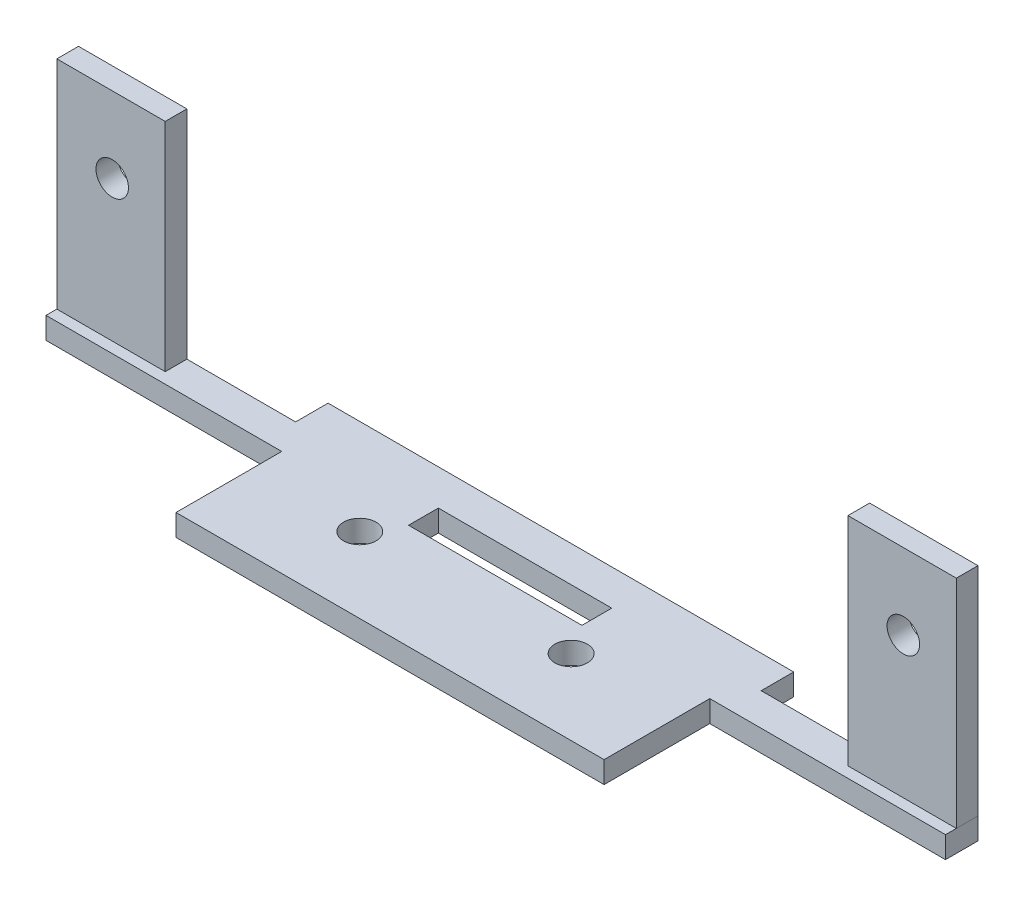
ISO-10303-21;
HEADER;
FILE_DESCRIPTION(('STEP AP214'),'2;1');
FILE_NAME('part.step','',(''),(''),'','','');
FILE_SCHEMA(('AUTOMOTIVE_DESIGN { 1 0 10303 214 1 1 1 1 }'));
ENDSEC;
DATA;
#1=APPLICATION_CONTEXT('core data for automotive mechanical design processes');
#2=APPLICATION_PROTOCOL_DEFINITION('international standard','automotive_design',2000,#1);
#3=PRODUCT_CONTEXT('',#1,'mechanical');
#4=PRODUCT('Part','Part','',(#3));
#5=PRODUCT_RELATED_PRODUCT_CATEGORY('part','',(#4));
#6=PRODUCT_DEFINITION_FORMATION('','',#4);
#7=PRODUCT_DEFINITION_CONTEXT('part definition',#1,'design');
#8=PRODUCT_DEFINITION('design','',#6,#7);
#9=PRODUCT_DEFINITION_SHAPE('','',#8);
#10=(LENGTH_UNIT() NAMED_UNIT(*) SI_UNIT(.MILLI.,.METRE.));
#11=(NAMED_UNIT(*) PLANE_ANGLE_UNIT() SI_UNIT($,.RADIAN.));
#12=(NAMED_UNIT(*) SI_UNIT($,.STERADIAN.) SOLID_ANGLE_UNIT());
#13=UNCERTAINTY_MEASURE_WITH_UNIT(LENGTH_MEASURE(1.E-05),#10,'distance_accuracy_value','');
#14=(GEOMETRIC_REPRESENTATION_CONTEXT(3) GLOBAL_UNCERTAINTY_ASSIGNED_CONTEXT((#13)) GLOBAL_UNIT_ASSIGNED_CONTEXT((#10,
#11,#12)) REPRESENTATION_CONTEXT('',''));
#15=CARTESIAN_POINT('',(0.,0.,0.));
#16=DIRECTION('',(0.,0.,1.));
#17=DIRECTION('',(1.,0.,0.));
#18=AXIS2_PLACEMENT_3D('',#15,#16,#17);
#19=CARTESIAN_POINT('',(12.8346456692914,20.,2.));
#20=DIRECTION('',(-1.,0.,0.));
#21=DIRECTION('',(0.,-1.,0.));
#22=AXIS2_PLACEMENT_3D('',#19,#20,#21);
#23=PLANE('',#22);
#24=DIRECTION('',(0.,1.,0.));
#25=VECTOR('',#24,1.);
#26=CARTESIAN_POINT('',(12.8346456692914,20.,0.));
#27=LINE('',#26,#25);
#28=CARTESIAN_POINT('',(12.8346456692914,0.,0.));
#29=VERTEX_POINT('',#28);
#30=CARTESIAN_POINT('',(12.8346456692914,20.,0.));
#31=VERTEX_POINT('',#30);
#32=EDGE_CURVE('E232',#29,#31,#27,.T.);
#33=ORIENTED_EDGE('',*,*,#32,.T.);
#34=DIRECTION('',(0.,0.,-1.));
#35=VECTOR('',#34,1.);
#36=CARTESIAN_POINT('',(12.8346456692914,20.,2.));
#37=LINE('',#36,#35);
#38=CARTESIAN_POINT('',(12.8346456692914,20.,2.));
#39=VERTEX_POINT('',#38);
#40=EDGE_CURVE('E253',#39,#31,#37,.T.);
#41=ORIENTED_EDGE('',*,*,#40,.F.);
#42=DIRECTION('',(0.,1.,0.));
#43=VECTOR('',#42,1.);
#44=CARTESIAN_POINT('',(12.8346456692914,20.,2.));
#45=LINE('',#44,#43);
#46=CARTESIAN_POINT('',(12.8346456692914,0.,2.));
#47=VERTEX_POINT('',#46);
#48=EDGE_CURVE('E238',#47,#39,#45,.T.);
#49=ORIENTED_EDGE('',*,*,#48,.F.);
#50=DIRECTION('',(0.,0.,-1.));
#51=VECTOR('',#50,1.);
#52=CARTESIAN_POINT('',(12.8346456692914,0.,2.));
#53=LINE('',#52,#51);
#54=EDGE_CURVE('E256',#47,#29,#53,.T.);
#55=ORIENTED_EDGE('',*,*,#54,.T.);
#56=EDGE_LOOP('',(#33,#41,#49,#55));
#57=FACE_BOUND('',#56,.T.);
#58=ADVANCED_FACE('F33',(#57),#23,.F.);
#59=CARTESIAN_POINT('',(2.83464566929135,20.,2.));
#60=DIRECTION('',(0.,-1.,0.));
#61=DIRECTION('',(0.,0.,-1.));
#62=AXIS2_PLACEMENT_3D('',#59,#60,#61);
#63=PLANE('',#62);
#64=DIRECTION('',(-1.,0.,0.));
#65=VECTOR('',#64,1.);
#66=CARTESIAN_POINT('',(2.83464566929135,20.,0.));
#67=LINE('',#66,#65);
#68=CARTESIAN_POINT('',(2.83464566929135,20.,0.));
#69=VERTEX_POINT('',#68);
#70=EDGE_CURVE('E248',#31,#69,#67,.T.);
#71=ORIENTED_EDGE('',*,*,#70,.T.);
#72=DIRECTION('',(0.,0.,-1.));
#73=VECTOR('',#72,1.);
#74=CARTESIAN_POINT('',(2.83464566929135,20.,2.));
#75=LINE('',#74,#73);
#76=CARTESIAN_POINT('',(2.83464566929135,20.,2.));
#77=VERTEX_POINT('',#76);
#78=EDGE_CURVE('E246',#77,#69,#75,.T.);
#79=ORIENTED_EDGE('',*,*,#78,.F.);
#80=DIRECTION('',(-1.,0.,0.));
#81=VECTOR('',#80,1.);
#82=CARTESIAN_POINT('',(2.83464566929135,20.,2.));
#83=LINE('',#82,#81);
#84=EDGE_CURVE('E241',#39,#77,#83,.T.);
#85=ORIENTED_EDGE('',*,*,#84,.F.);
#86=ORIENTED_EDGE('',*,*,#40,.T.);
#87=EDGE_LOOP('',(#71,#79,#85,#86));
#88=FACE_BOUND('',#87,.T.);
#89=ADVANCED_FACE('F482',(#88),#63,.F.);
#90=CARTESIAN_POINT('',(2.83464566929135,0.,2.));
#91=DIRECTION('',(1.,0.,0.));
#92=DIRECTION('',(0.,0.,-1.));
#93=AXIS2_PLACEMENT_3D('',#90,#91,#92);
#94=PLANE('',#93);
#95=DIRECTION('',(0.,-1.,0.));
#96=VECTOR('',#95,1.);
#97=CARTESIAN_POINT('',(2.83464566929135,0.,0.));
#98=LINE('',#97,#96);
#99=CARTESIAN_POINT('',(2.83464566929135,-2.,0.));
#100=VERTEX_POINT('',#99);
#101=EDGE_CURVE('E239',#69,#100,#98,.T.);
#102=ORIENTED_EDGE('',*,*,#101,.T.);
#103=DIRECTION('',(0.,0.,1.));
#104=VECTOR('',#103,1.);
#105=CARTESIAN_POINT('',(2.83464566929135,-2.,-3.));
#106=LINE('',#105,#104);
#107=CARTESIAN_POINT('',(2.83464566929135,-2.,3.));
#108=VERTEX_POINT('',#107);
#109=EDGE_CURVE('E220',#100,#108,#106,.T.);
#110=ORIENTED_EDGE('',*,*,#109,.T.);
#111=DIRECTION('',(0.,-1.,0.));
#112=VECTOR('',#111,1.);
#113=CARTESIAN_POINT('',(2.83464566929135,13.,3.));
#114=LINE('',#113,#112);
#115=CARTESIAN_POINT('',(2.83464566929135,0.,3.));
#116=VERTEX_POINT('',#115);
#117=EDGE_CURVE('E294',#116,#108,#114,.T.);
#118=ORIENTED_EDGE('',*,*,#117,.F.);
#119=DIRECTION('',(0.,0.,1.));
#120=VECTOR('',#119,1.);
#121=CARTESIAN_POINT('',(2.83464566929135,0.,-3.));
#122=LINE('',#121,#120);
#123=CARTESIAN_POINT('',(2.83464566929135,0.,2.));
#124=VERTEX_POINT('',#123);
#125=EDGE_CURVE('E223',#124,#116,#122,.T.);
#126=ORIENTED_EDGE('',*,*,#125,.F.);
#127=DIRECTION('',(0.,-1.,0.));
#128=VECTOR('',#127,1.);
#129=CARTESIAN_POINT('',(2.83464566929135,0.,2.));
#130=LINE('',#129,#128);
#131=EDGE_CURVE('E243',#77,#124,#130,.T.);
#132=ORIENTED_EDGE('',*,*,#131,.F.);
#133=ORIENTED_EDGE('',*,*,#78,.T.);
#134=EDGE_LOOP('',(#102,#110,#118,#126,#132,#133));
#135=FACE_BOUND('',#134,.T.);
#136=ADVANCED_FACE('F428',(#135),#94,.F.);
#137=CARTESIAN_POINT('',(0.,0.,2.));
#138=DIRECTION('',(0.,0.,-1.));
#139=DIRECTION('',(-1.,0.,0.));
#140=AXIS2_PLACEMENT_3D('',#137,#138,#139);
#141=PLANE('',#140);
#142=CARTESIAN_POINT('',(7.94345884887559,13.,2.));
#143=DIRECTION('',(0.,0.,-1.));
#144=DIRECTION('',(-1.,0.,0.));
#145=AXIS2_PLACEMENT_3D('',#142,#143,#144);
#146=CIRCLE('',#145,1.5);
#147=CARTESIAN_POINT('',(6.44345884887559,13.,2.));
#148=VERTEX_POINT('',#147);
#149=EDGE_CURVE('E229',#148,#148,#146,.T.);
#150=ORIENTED_EDGE('',*,*,#149,.T.);
#151=EDGE_LOOP('',(#150));
#152=FACE_BOUND('',#151,.T.);
#153=DIRECTION('',(1.,0.,0.));
#154=VECTOR('',#153,1.);
#155=CARTESIAN_POINT('',(12.8346456692914,0.,2.));
#156=LINE('',#155,#154);
#157=EDGE_CURVE('E235',#124,#47,#156,.T.);
#158=ORIENTED_EDGE('',*,*,#157,.T.);
#159=ORIENTED_EDGE('',*,*,#48,.T.);
#160=ORIENTED_EDGE('',*,*,#84,.T.);
#161=ORIENTED_EDGE('',*,*,#131,.T.);
#162=EDGE_LOOP('',(#158,#159,#160,#161));
#163=FACE_BOUND('',#162,.T.);
#164=ADVANCED_FACE('F424',(#152,#163),#141,.F.);
#165=CARTESIAN_POINT('',(0.,0.,0.));
#166=DIRECTION('',(0.,0.,-1.));
#167=DIRECTION('',(-1.,0.,0.));
#168=AXIS2_PLACEMENT_3D('',#165,#166,#167);
#169=PLANE('',#168);
#170=CARTESIAN_POINT('',(7.94345884887559,13.,0.));
#171=DIRECTION('',(0.,0.,-1.));
#172=DIRECTION('',(-1.,0.,0.));
#173=AXIS2_PLACEMENT_3D('',#170,#171,#172);
#174=CIRCLE('',#173,1.5);
#175=CARTESIAN_POINT('',(6.44345884887559,13.,0.));
#176=VERTEX_POINT('',#175);
#177=EDGE_CURVE('E222',#176,#176,#174,.T.);
#178=ORIENTED_EDGE('',*,*,#177,.F.);
#179=EDGE_LOOP('',(#178));
#180=FACE_BOUND('',#179,.T.);
#181=ORIENTED_EDGE('',*,*,#32,.F.);
#182=DIRECTION('',(1.,0.,0.));
#183=VECTOR('',#182,1.);
#184=CARTESIAN_POINT('',(2.83464566929135,0.,0.));
#185=LINE('',#184,#183);
#186=CARTESIAN_POINT('',(22.8650463121555,0.,0.));
#187=VERTEX_POINT('',#186);
#188=EDGE_CURVE('E412',#29,#187,#185,.T.);
#189=ORIENTED_EDGE('',*,*,#188,.T.);
#190=DIRECTION('',(0.,1.,0.));
#191=VECTOR('',#190,1.);
#192=CARTESIAN_POINT('',(22.8650463121555,-15.,0.));
#193=LINE('',#192,#191);
#194=CARTESIAN_POINT('',(22.8650463121555,-2.,0.));
#195=VERTEX_POINT('',#194);
#196=EDGE_CURVE('E208',#195,#187,#193,.T.);
#197=ORIENTED_EDGE('',*,*,#196,.F.);
#198=DIRECTION('',(-1.,0.,0.));
#199=VECTOR('',#198,1.);
#200=CARTESIAN_POINT('',(2.83464566929135,-2.,0.));
#201=LINE('',#200,#199);
#202=EDGE_CURVE('E11',#195,#100,#201,.T.);
#203=ORIENTED_EDGE('',*,*,#202,.T.);
#204=ORIENTED_EDGE('',*,*,#101,.F.);
#205=ORIENTED_EDGE('',*,*,#70,.F.);
#206=EDGE_LOOP('',(#181,#189,#197,#203,#204,#205));
#207=FACE_BOUND('',#206,.T.);
#208=ADVANCED_FACE('F416',(#180,#207),#169,.T.);
#209=CARTESIAN_POINT('',(7.94345884887559,13.,2.));
#210=DIRECTION('',(0.,0.,-1.));
#211=DIRECTION('',(-1.,0.,0.));
#212=AXIS2_PLACEMENT_3D('',#209,#210,#211);
#213=CYLINDRICAL_SURFACE('',#212,1.5);
#214=ORIENTED_EDGE('',*,*,#149,.F.);
#215=EDGE_LOOP('',(#214));
#216=FACE_BOUND('',#215,.T.);
#217=ORIENTED_EDGE('',*,*,#177,.T.);
#218=EDGE_LOOP('',(#217));
#219=FACE_BOUND('',#218,.T.);
#220=ADVANCED_FACE('F494',(#216,#219),#213,.F.);
#221=CARTESIAN_POINT('',(2.83464566929135,0.,-3.));
#222=DIRECTION('',(0.,-1.,0.));
#223=DIRECTION('',(0.,0.,-1.));
#224=AXIS2_PLACEMENT_3D('',#221,#222,#223);
#225=PLANE('',#224);
#226=CARTESIAN_POINT('',(54.0846456692914,0.,5.79627229332452));
#227=DIRECTION('',(0.,-1.,0.));
#228=DIRECTION('',(0.,0.,-1.));
#229=AXIS2_PLACEMENT_3D('',#226,#227,#228);
#230=CIRCLE('',#229,1.5);
#231=CARTESIAN_POINT('',(54.0846456692914,0.,4.29627229332452));
#232=VERTEX_POINT('',#231);
#233=EDGE_CURVE('E362',#232,#232,#230,.T.);
#234=ORIENTED_EDGE('',*,*,#233,.T.);
#235=EDGE_LOOP('',(#234));
#236=FACE_BOUND('',#235,.T.);
#237=CARTESIAN_POINT('',(34.5846456692914,0.,5.79627229332452));
#238=DIRECTION('',(0.,-1.,0.));
#239=DIRECTION('',(0.,0.,-1.));
#240=AXIS2_PLACEMENT_3D('',#237,#238,#239);
#241=CIRCLE('',#240,1.5);
#242=CARTESIAN_POINT('',(34.5846456692914,0.,4.29627229332452));
#243=VERTEX_POINT('',#242);
#244=EDGE_CURVE('E359',#243,#243,#241,.T.);
#245=ORIENTED_EDGE('',*,*,#244,.T.);
#246=EDGE_LOOP('',(#245));
#247=FACE_BOUND('',#246,.T.);
#248=DIRECTION('',(1.,0.,0.));
#249=VECTOR('',#248,1.);
#250=CARTESIAN_POINT('',(2.83464566929135,0.,0.296272293324518));
#251=LINE('',#250,#249);
#252=CARTESIAN_POINT('',(36.3346456692914,0.,0.296272293324522));
#253=VERTEX_POINT('',#252);
#254=CARTESIAN_POINT('',(52.3346456692914,0.,0.296272293324524));
#255=VERTEX_POINT('',#254);
#256=EDGE_CURVE('E341',#253,#255,#251,.T.);
#257=ORIENTED_EDGE('',*,*,#256,.T.);
#258=DIRECTION('',(0.,0.,1.));
#259=VECTOR('',#258,1.);
#260=CARTESIAN_POINT('',(52.3346456692914,0.,-3.));
#261=LINE('',#260,#259);
#262=CARTESIAN_POINT('',(52.3346456692914,0.,3.04627229332452));
#263=VERTEX_POINT('',#262);
#264=EDGE_CURVE('E344',#255,#263,#261,.T.);
#265=ORIENTED_EDGE('',*,*,#264,.T.);
#266=DIRECTION('',(-1.,0.,0.));
#267=VECTOR('',#266,1.);
#268=CARTESIAN_POINT('',(2.83464566929135,0.,3.04627229332452));
#269=LINE('',#268,#267);
#270=CARTESIAN_POINT('',(36.3346456692914,0.,3.04627229332452));
#271=VERTEX_POINT('',#270);
#272=EDGE_CURVE('E335',#263,#271,#269,.T.);
#273=ORIENTED_EDGE('',*,*,#272,.T.);
#274=DIRECTION('',(0.,0.,-1.));
#275=VECTOR('',#274,1.);
#276=CARTESIAN_POINT('',(36.3346456692914,0.,-3.));
#277=LINE('',#276,#275);
#278=EDGE_CURVE('E338',#271,#253,#277,.T.);
#279=ORIENTED_EDGE('',*,*,#278,.T.);
#280=EDGE_LOOP('',(#257,#265,#273,#279));
#281=FACE_BOUND('',#280,.T.);
#282=DIRECTION('',(0.,0.,-1.));
#283=VECTOR('',#282,1.);
#284=CARTESIAN_POINT('',(75.8346456692913,0.,2.));
#285=LINE('',#284,#283);
#286=CARTESIAN_POINT('',(75.8346456692913,0.,2.));
#287=VERTEX_POINT('',#286);
#288=CARTESIAN_POINT('',(75.8346456692913,0.,0.));
#289=VERTEX_POINT('',#288);
#290=EDGE_CURVE('E216',#287,#289,#285,.T.);
#291=ORIENTED_EDGE('',*,*,#290,.T.);
#292=DIRECTION('',(1.,0.,0.));
#293=VECTOR('',#292,1.);
#294=CARTESIAN_POINT('',(85.8333993238776,0.,0.));
#295=LINE('',#294,#293);
#296=CARTESIAN_POINT('',(65.8262200732631,0.,0.));
#297=VERTEX_POINT('',#296);
#298=EDGE_CURVE('E207',#297,#289,#295,.T.);
#299=ORIENTED_EDGE('',*,*,#298,.F.);
#300=DIRECTION('',(0.,0.,1.));
#301=VECTOR('',#300,1.);
#302=CARTESIAN_POINT('',(65.8262200732631,0.,-3.));
#303=LINE('',#302,#301);
#304=CARTESIAN_POINT('',(65.8262200732631,0.,-3.));
#305=VERTEX_POINT('',#304);
#306=EDGE_CURVE('E193',#305,#297,#303,.T.);
#307=ORIENTED_EDGE('',*,*,#306,.F.);
#308=DIRECTION('',(1.,0.,0.));
#309=VECTOR('',#308,1.);
#310=CARTESIAN_POINT('',(2.83464566929135,0.,-3.));
#311=LINE('',#310,#309);
#312=CARTESIAN_POINT('',(22.8650463121555,0.,-3.));
#313=VERTEX_POINT('',#312);
#314=EDGE_CURVE('E206',#313,#305,#311,.T.);
#315=ORIENTED_EDGE('',*,*,#314,.F.);
#316=DIRECTION('',(0.,0.,-1.));
#317=VECTOR('',#316,1.);
#318=CARTESIAN_POINT('',(22.8650463121555,0.,-3.));
#319=LINE('',#318,#317);
#320=EDGE_CURVE('E47',#187,#313,#319,.T.);
#321=ORIENTED_EDGE('',*,*,#320,.F.);
#322=ORIENTED_EDGE('',*,*,#188,.F.);
#323=ORIENTED_EDGE('',*,*,#54,.F.);
#324=ORIENTED_EDGE('',*,*,#157,.F.);
#325=ORIENTED_EDGE('',*,*,#125,.T.);
#326=DIRECTION('',(1.,0.,0.));
#327=VECTOR('',#326,1.);
#328=CARTESIAN_POINT('',(2.83464566929135,0.,3.));
#329=LINE('',#328,#327);
#330=CARTESIAN_POINT('',(24.5846456692914,0.,3.));
#331=VERTEX_POINT('',#330);
#332=EDGE_CURVE('E347',#116,#331,#329,.T.);
#333=ORIENTED_EDGE('',*,*,#332,.T.);
#334=DIRECTION('',(0.,0.,1.));
#335=VECTOR('',#334,1.);
#336=CARTESIAN_POINT('',(24.5846456692914,0.,-3.));
#337=LINE('',#336,#335);
#338=CARTESIAN_POINT('',(24.5846456692914,0.,12.7527164771307));
#339=VERTEX_POINT('',#338);
#340=EDGE_CURVE('E350',#331,#339,#337,.T.);
#341=ORIENTED_EDGE('',*,*,#340,.T.);
#342=DIRECTION('',(1.,0.,0.));
#343=VECTOR('',#342,1.);
#344=CARTESIAN_POINT('',(2.83464566929135,0.,12.7527164771307));
#345=LINE('',#344,#343);
#346=CARTESIAN_POINT('',(64.0846456692914,0.,12.7527164771307));
#347=VERTEX_POINT('',#346);
#348=EDGE_CURVE('E353',#339,#347,#345,.T.);
#349=ORIENTED_EDGE('',*,*,#348,.T.);
#350=DIRECTION('',(0.,0.,-1.));
#351=VECTOR('',#350,1.);
#352=CARTESIAN_POINT('',(64.0846456692913,0.,-3.00000000000009));
#353=LINE('',#352,#351);
#354=CARTESIAN_POINT('',(64.0846456692913,0.,3.));
#355=VERTEX_POINT('',#354);
#356=EDGE_CURVE('E356',#347,#355,#353,.T.);
#357=ORIENTED_EDGE('',*,*,#356,.T.);
#358=DIRECTION('',(1.,0.,0.));
#359=VECTOR('',#358,1.);
#360=CARTESIAN_POINT('',(2.83464566929135,0.,2.99999999999999));
#361=LINE('',#360,#359);
#362=CARTESIAN_POINT('',(85.8333993238776,0.,3.));
#363=VERTEX_POINT('',#362);
#364=EDGE_CURVE('E327',#355,#363,#361,.T.);
#365=ORIENTED_EDGE('',*,*,#364,.T.);
#366=DIRECTION('',(0.,0.,1.));
#367=VECTOR('',#366,1.);
#368=CARTESIAN_POINT('',(85.8333993238776,0.,-3.));
#369=LINE('',#368,#367);
#370=CARTESIAN_POINT('',(85.8333993238776,0.,2.));
#371=VERTEX_POINT('',#370);
#372=EDGE_CURVE('E214',#371,#363,#369,.T.);
#373=ORIENTED_EDGE('',*,*,#372,.F.);
#374=DIRECTION('',(1.,0.,0.));
#375=VECTOR('',#374,1.);
#376=CARTESIAN_POINT('',(75.8346456692913,0.,2.));
#377=LINE('',#376,#375);
#378=EDGE_CURVE('E376',#287,#371,#377,.T.);
#379=ORIENTED_EDGE('',*,*,#378,.F.);
#380=EDGE_LOOP('',(#291,#299,#307,#315,#321,#322,#323,#324,#325,#333,#341,#349,#357,#365,#373,#379));
#381=FACE_BOUND('',#380,.T.);
#382=ADVANCED_FACE('F205',(#236,#247,#281,#381),#225,.F.);
#383=CARTESIAN_POINT('',(2.83464566929135,-2.,-3.));
#384=DIRECTION('',(0.,-1.,0.));
#385=DIRECTION('',(0.,0.,-1.));
#386=AXIS2_PLACEMENT_3D('',#383,#384,#385);
#387=PLANE('',#386);
#388=DIRECTION('',(-1.,0.,0.));
#389=VECTOR('',#388,1.);
#390=CARTESIAN_POINT('',(2.83464566929135,-2.,0.));
#391=LINE('',#390,#389);
#392=CARTESIAN_POINT('',(85.8333993238776,-2.,0.));
#393=VERTEX_POINT('',#392);
#394=CARTESIAN_POINT('',(65.8262200732631,-2.,0.));
#395=VERTEX_POINT('',#394);
#396=EDGE_CURVE('E271',#393,#395,#391,.T.);
#397=ORIENTED_EDGE('',*,*,#396,.F.);
#398=DIRECTION('',(0.,0.,1.));
#399=VECTOR('',#398,1.);
#400=CARTESIAN_POINT('',(85.8333993238776,-2.,-3.));
#401=LINE('',#400,#399);
#402=CARTESIAN_POINT('',(85.8333993238776,-2.,3.));
#403=VERTEX_POINT('',#402);
#404=EDGE_CURVE('E211',#393,#403,#401,.T.);
#405=ORIENTED_EDGE('',*,*,#404,.T.);
#406=DIRECTION('',(1.,0.,0.));
#407=VECTOR('',#406,1.);
#408=CARTESIAN_POINT('',(85.8333993238776,-2.,3.));
#409=LINE('',#408,#407);
#410=CARTESIAN_POINT('',(64.0846456692913,-2.,3.));
#411=VERTEX_POINT('',#410);
#412=EDGE_CURVE('E291',#411,#403,#409,.T.);
#413=ORIENTED_EDGE('',*,*,#412,.F.);
#414=DIRECTION('',(0.,0.,-1.));
#415=VECTOR('',#414,1.);
#416=CARTESIAN_POINT('',(64.0846456692913,-2.,3.));
#417=LINE('',#416,#415);
#418=CARTESIAN_POINT('',(64.0846456692914,-2.,12.7527164771307));
#419=VERTEX_POINT('',#418);
#420=EDGE_CURVE('E288',#419,#411,#417,.T.);
#421=ORIENTED_EDGE('',*,*,#420,.F.);
#422=DIRECTION('',(1.,0.,0.));
#423=VECTOR('',#422,1.);
#424=CARTESIAN_POINT('',(64.0846456692914,-2.,12.7527164771307));
#425=LINE('',#424,#423);
#426=CARTESIAN_POINT('',(24.5846456692914,-2.,12.7527164771307));
#427=VERTEX_POINT('',#426);
#428=EDGE_CURVE('E285',#427,#419,#425,.T.);
#429=ORIENTED_EDGE('',*,*,#428,.F.);
#430=DIRECTION('',(0.,0.,1.));
#431=VECTOR('',#430,1.);
#432=CARTESIAN_POINT('',(24.5846456692914,-2.,12.7527164771307));
#433=LINE('',#432,#431);
#434=CARTESIAN_POINT('',(24.5846456692914,-2.,3.));
#435=VERTEX_POINT('',#434);
#436=EDGE_CURVE('E282',#435,#427,#433,.T.);
#437=ORIENTED_EDGE('',*,*,#436,.F.);
#438=DIRECTION('',(1.,0.,0.));
#439=VECTOR('',#438,1.);
#440=CARTESIAN_POINT('',(24.5846456692914,-2.,3.));
#441=LINE('',#440,#439);
#442=EDGE_CURVE('E279',#108,#435,#441,.T.);
#443=ORIENTED_EDGE('',*,*,#442,.F.);
#444=ORIENTED_EDGE('',*,*,#109,.F.);
#445=ORIENTED_EDGE('',*,*,#202,.F.);
#446=DIRECTION('',(0.,0.,1.));
#447=VECTOR('',#446,1.);
#448=CARTESIAN_POINT('',(22.8650463121555,-2.,-3.));
#449=LINE('',#448,#447);
#450=CARTESIAN_POINT('',(22.8650463121555,-2.,-3.));
#451=VERTEX_POINT('',#450);
#452=EDGE_CURVE('E261',#451,#195,#449,.T.);
#453=ORIENTED_EDGE('',*,*,#452,.F.);
#454=DIRECTION('',(1.,0.,0.));
#455=VECTOR('',#454,1.);
#456=CARTESIAN_POINT('',(2.83464566929135,-2.,-3.));
#457=LINE('',#456,#455);
#458=CARTESIAN_POINT('',(65.8262200732631,-2.,-3.));
#459=VERTEX_POINT('',#458);
#460=EDGE_CURVE('E212',#451,#459,#457,.T.);
#461=ORIENTED_EDGE('',*,*,#460,.T.);
#462=DIRECTION('',(0.,0.,-1.));
#463=VECTOR('',#462,1.);
#464=CARTESIAN_POINT('',(65.8262200732631,-2.,-3.));
#465=LINE('',#464,#463);
#466=EDGE_CURVE('E196',#395,#459,#465,.T.);
#467=ORIENTED_EDGE('',*,*,#466,.F.);
#468=EDGE_LOOP('',(#397,#405,#413,#421,#429,#437,#443,#444,#445,#453,#461,#467));
#469=FACE_BOUND('',#468,.T.);
#470=CARTESIAN_POINT('',(54.0846456692914,-2.,5.79627229332452));
#471=DIRECTION('',(0.,-1.,0.));
#472=DIRECTION('',(0.,0.,-1.));
#473=AXIS2_PLACEMENT_3D('',#470,#471,#472);
#474=CIRCLE('',#473,1.5);
#475=CARTESIAN_POINT('',(54.0846456692914,-2.,4.29627229332452));
#476=VERTEX_POINT('',#475);
#477=EDGE_CURVE('E309',#476,#476,#474,.T.);
#478=ORIENTED_EDGE('',*,*,#477,.F.);
#479=EDGE_LOOP('',(#478));
#480=FACE_BOUND('',#479,.T.);
#481=CARTESIAN_POINT('',(34.5846456692914,-2.,5.79627229332452));
#482=DIRECTION('',(0.,-1.,0.));
#483=DIRECTION('',(0.,0.,-1.));
#484=AXIS2_PLACEMENT_3D('',#481,#482,#483);
#485=CIRCLE('',#484,1.5);
#486=CARTESIAN_POINT('',(34.5846456692914,-2.,4.29627229332452));
#487=VERTEX_POINT('',#486);
#488=EDGE_CURVE('E298',#487,#487,#485,.T.);
#489=ORIENTED_EDGE('',*,*,#488,.F.);
#490=EDGE_LOOP('',(#489));
#491=FACE_BOUND('',#490,.T.);
#492=DIRECTION('',(0.,0.,1.));
#493=VECTOR('',#492,1.);
#494=CARTESIAN_POINT('',(52.3346456692914,-2.,0.296272293324524));
#495=LINE('',#494,#493);
#496=CARTESIAN_POINT('',(52.3346456692914,-2.,0.296272293324524));
#497=VERTEX_POINT('',#496);
#498=CARTESIAN_POINT('',(52.3346456692914,-2.,3.04627229332452));
#499=VERTEX_POINT('',#498);
#500=EDGE_CURVE('E312',#497,#499,#495,.T.);
#501=ORIENTED_EDGE('',*,*,#500,.F.);
#502=DIRECTION('',(1.,0.,0.));
#503=VECTOR('',#502,1.);
#504=CARTESIAN_POINT('',(52.3346456692914,-2.,0.296272293324524));
#505=LINE('',#504,#503);
#506=CARTESIAN_POINT('',(36.3346456692914,-2.,0.296272293324522));
#507=VERTEX_POINT('',#506);
#508=EDGE_CURVE('E321',#507,#497,#505,.T.);
#509=ORIENTED_EDGE('',*,*,#508,.F.);
#510=DIRECTION('',(0.,0.,-1.));
#511=VECTOR('',#510,1.);
#512=CARTESIAN_POINT('',(36.3346456692914,-2.,0.296272293324522));
#513=LINE('',#512,#511);
#514=CARTESIAN_POINT('',(36.3346456692914,-2.,3.04627229332452));
#515=VERTEX_POINT('',#514);
#516=EDGE_CURVE('E318',#515,#507,#513,.T.);
#517=ORIENTED_EDGE('',*,*,#516,.F.);
#518=DIRECTION('',(-1.,0.,0.));
#519=VECTOR('',#518,1.);
#520=CARTESIAN_POINT('',(52.3346456692914,-2.,3.04627229332452));
#521=LINE('',#520,#519);
#522=EDGE_CURVE('E316',#499,#515,#521,.T.);
#523=ORIENTED_EDGE('',*,*,#522,.F.);
#524=EDGE_LOOP('',(#501,#509,#517,#523));
#525=FACE_BOUND('',#524,.T.);
#526=ADVANCED_FACE('F266',(#469,#480,#491,#525),#387,.T.);
#527=CARTESIAN_POINT('',(85.8333993238776,0.,-3.));
#528=DIRECTION('',(-1.,0.,0.));
#529=DIRECTION('',(0.,0.,1.));
#530=AXIS2_PLACEMENT_3D('',#527,#528,#529);
#531=PLANE('',#530);
#532=ORIENTED_EDGE('',*,*,#404,.F.);
#533=DIRECTION('',(0.,1.,0.));
#534=VECTOR('',#533,1.);
#535=CARTESIAN_POINT('',(85.8333993238776,-15.,0.));
#536=LINE('',#535,#534);
#537=CARTESIAN_POINT('',(85.8333993238776,0.,0.));
#538=VERTEX_POINT('',#537);
#539=EDGE_CURVE('E269',#393,#538,#536,.T.);
#540=ORIENTED_EDGE('',*,*,#539,.T.);
#541=EDGE_CURVE('E226',#538,#371,#369,.T.);
#542=ORIENTED_EDGE('',*,*,#541,.T.);
#543=ORIENTED_EDGE('',*,*,#372,.T.);
#544=DIRECTION('',(0.,-1.,0.));
#545=VECTOR('',#544,1.);
#546=CARTESIAN_POINT('',(85.8333993238776,13.,3.));
#547=LINE('',#546,#545);
#548=EDGE_CURVE('E295',#363,#403,#547,.T.);
#549=ORIENTED_EDGE('',*,*,#548,.T.);
#550=EDGE_LOOP('',(#532,#540,#542,#543,#549));
#551=FACE_BOUND('',#550,.T.);
#552=ADVANCED_FACE('F452',(#551),#531,.F.);
#553=CARTESIAN_POINT('',(0.,0.,-3.));
#554=DIRECTION('',(0.,0.,-1.));
#555=DIRECTION('',(-1.,0.,0.));
#556=AXIS2_PLACEMENT_3D('',#553,#554,#555);
#557=PLANE('',#556);
#558=DIRECTION('',(0.,1.,0.));
#559=VECTOR('',#558,1.);
#560=CARTESIAN_POINT('',(65.8262200732631,0.,-3.));
#561=LINE('',#560,#559);
#562=EDGE_CURVE('E40',#459,#305,#561,.T.);
#563=ORIENTED_EDGE('',*,*,#562,.F.);
#564=ORIENTED_EDGE('',*,*,#460,.F.);
#565=DIRECTION('',(0.,-1.,0.));
#566=VECTOR('',#565,1.);
#567=CARTESIAN_POINT('',(22.8650463121555,0.,-3.));
#568=LINE('',#567,#566);
#569=EDGE_CURVE('E201',#313,#451,#568,.T.);
#570=ORIENTED_EDGE('',*,*,#569,.F.);
#571=ORIENTED_EDGE('',*,*,#314,.T.);
#572=EDGE_LOOP('',(#563,#564,#570,#571));
#573=FACE_BOUND('',#572,.T.);
#574=ADVANCED_FACE('F210',(#573),#557,.T.);
#575=CARTESIAN_POINT('',(75.8346456692913,0.,2.));
#576=DIRECTION('',(0.,1.,0.));
#577=DIRECTION('',(-1.,0.,0.));
#578=AXIS2_PLACEMENT_3D('',#575,#576,#577);
#579=PLANE('',#578);
#580=CARTESIAN_POINT('',(85.8346456692914,0.,2.));
#581=VERTEX_POINT('',#580);
#582=EDGE_CURVE('E374',#371,#581,#377,.T.);
#583=ORIENTED_EDGE('',*,*,#582,.F.);
#584=ORIENTED_EDGE('',*,*,#541,.F.);
#585=DIRECTION('',(1.,0.,0.));
#586=VECTOR('',#585,1.);
#587=CARTESIAN_POINT('',(75.8346456692913,0.,0.));
#588=LINE('',#587,#586);
#589=CARTESIAN_POINT('',(85.8346456692914,0.,0.));
#590=VERTEX_POINT('',#589);
#591=EDGE_CURVE('E385',#538,#590,#588,.T.);
#592=ORIENTED_EDGE('',*,*,#591,.T.);
#593=DIRECTION('',(0.,0.,-1.));
#594=VECTOR('',#593,1.);
#595=CARTESIAN_POINT('',(85.8346456692914,0.,2.));
#596=LINE('',#595,#594);
#597=EDGE_CURVE('E395',#581,#590,#596,.T.);
#598=ORIENTED_EDGE('',*,*,#597,.F.);
#599=EDGE_LOOP('',(#583,#584,#592,#598));
#600=FACE_BOUND('',#599,.T.);
#601=ADVANCED_FACE('F458',(#600),#579,.F.);
#602=CARTESIAN_POINT('',(75.8346456692913,20.,2.));
#603=DIRECTION('',(1.,0.,0.));
#604=DIRECTION('',(0.,0.,-1.));
#605=AXIS2_PLACEMENT_3D('',#602,#603,#604);
#606=PLANE('',#605);
#607=DIRECTION('',(0.,-1.,0.));
#608=VECTOR('',#607,1.);
#609=CARTESIAN_POINT('',(75.8346456692913,20.,0.));
#610=LINE('',#609,#608);
#611=CARTESIAN_POINT('',(75.8346456692913,20.,0.));
#612=VERTEX_POINT('',#611);
#613=EDGE_CURVE('E369',#612,#289,#610,.T.);
#614=ORIENTED_EDGE('',*,*,#613,.T.);
#615=ORIENTED_EDGE('',*,*,#290,.F.);
#616=DIRECTION('',(0.,-1.,0.));
#617=VECTOR('',#616,1.);
#618=CARTESIAN_POINT('',(75.8346456692913,20.,2.));
#619=LINE('',#618,#617);
#620=CARTESIAN_POINT('',(75.8346456692913,20.,2.));
#621=VERTEX_POINT('',#620);
#622=EDGE_CURVE('E372',#621,#287,#619,.T.);
#623=ORIENTED_EDGE('',*,*,#622,.F.);
#624=DIRECTION('',(0.,0.,-1.));
#625=VECTOR('',#624,1.);
#626=CARTESIAN_POINT('',(75.8346456692913,20.,2.));
#627=LINE('',#626,#625);
#628=EDGE_CURVE('E382',#621,#612,#627,.T.);
#629=ORIENTED_EDGE('',*,*,#628,.T.);
#630=EDGE_LOOP('',(#614,#615,#623,#629));
#631=FACE_BOUND('',#630,.T.);
#632=ADVANCED_FACE('F402',(#631),#606,.F.);
#633=CARTESIAN_POINT('',(85.8346456692914,20.,2.));
#634=DIRECTION('',(-1.,0.,0.));
#635=DIRECTION('',(0.,0.,1.));
#636=AXIS2_PLACEMENT_3D('',#633,#634,#635);
#637=PLANE('',#636);
#638=DIRECTION('',(0.,1.,0.));
#639=VECTOR('',#638,1.);
#640=CARTESIAN_POINT('',(85.8346456692914,20.,0.));
#641=LINE('',#640,#639);
#642=CARTESIAN_POINT('',(85.8346456692914,20.,0.));
#643=VERTEX_POINT('',#642);
#644=EDGE_CURVE('E387',#590,#643,#641,.T.);
#645=ORIENTED_EDGE('',*,*,#644,.T.);
#646=DIRECTION('',(0.,0.,-1.));
#647=VECTOR('',#646,1.);
#648=CARTESIAN_POINT('',(85.8346456692914,20.,2.));
#649=LINE('',#648,#647);
#650=CARTESIAN_POINT('',(85.8346456692914,20.,2.));
#651=VERTEX_POINT('',#650);
#652=EDGE_CURVE('E392',#651,#643,#649,.T.);
#653=ORIENTED_EDGE('',*,*,#652,.F.);
#654=DIRECTION('',(0.,1.,0.));
#655=VECTOR('',#654,1.);
#656=CARTESIAN_POINT('',(85.8346456692914,20.,2.));
#657=LINE('',#656,#655);
#658=EDGE_CURVE('E378',#581,#651,#657,.T.);
#659=ORIENTED_EDGE('',*,*,#658,.F.);
#660=ORIENTED_EDGE('',*,*,#597,.T.);
#661=EDGE_LOOP('',(#645,#653,#659,#660));
#662=FACE_BOUND('',#661,.T.);
#663=ADVANCED_FACE('F462',(#662),#637,.F.);
#664=CARTESIAN_POINT('',(75.8346456692913,20.,2.));
#665=DIRECTION('',(0.,-1.,0.));
#666=DIRECTION('',(1.,0.,0.));
#667=AXIS2_PLACEMENT_3D('',#664,#665,#666);
#668=PLANE('',#667);
#669=DIRECTION('',(-1.,0.,0.));
#670=VECTOR('',#669,1.);
#671=CARTESIAN_POINT('',(75.8346456692913,20.,0.));
#672=LINE('',#671,#670);
#673=EDGE_CURVE('E375',#643,#612,#672,.T.);
#674=ORIENTED_EDGE('',*,*,#673,.T.);
#675=ORIENTED_EDGE('',*,*,#628,.F.);
#676=DIRECTION('',(-1.,0.,0.));
#677=VECTOR('',#676,1.);
#678=CARTESIAN_POINT('',(75.8346456692913,20.,2.));
#679=LINE('',#678,#677);
#680=EDGE_CURVE('E380',#651,#621,#679,.T.);
#681=ORIENTED_EDGE('',*,*,#680,.F.);
#682=ORIENTED_EDGE('',*,*,#652,.T.);
#683=EDGE_LOOP('',(#674,#675,#681,#682));
#684=FACE_BOUND('',#683,.T.);
#685=ADVANCED_FACE('F466',(#684),#668,.F.);
#686=CARTESIAN_POINT('',(0.,0.,2.));
#687=DIRECTION('',(0.,0.,1.));
#688=DIRECTION('',(1.,0.,0.));
#689=AXIS2_PLACEMENT_3D('',#686,#687,#688);
#690=PLANE('',#689);
#691=CARTESIAN_POINT('',(80.9434588488756,13.,2.));
#692=DIRECTION('',(0.,0.,-1.));
#693=DIRECTION('',(-1.,0.,0.));
#694=AXIS2_PLACEMENT_3D('',#691,#692,#693);
#695=CIRCLE('',#694,1.5);
#696=CARTESIAN_POINT('',(79.4434588488756,13.,2.));
#697=VERTEX_POINT('',#696);
#698=EDGE_CURVE('E366',#697,#697,#695,.T.);
#699=ORIENTED_EDGE('',*,*,#698,.T.);
#700=EDGE_LOOP('',(#699));
#701=FACE_BOUND('',#700,.T.);
#702=ORIENTED_EDGE('',*,*,#622,.T.);
#703=ORIENTED_EDGE('',*,*,#378,.T.);
#704=ORIENTED_EDGE('',*,*,#582,.T.);
#705=ORIENTED_EDGE('',*,*,#658,.T.);
#706=ORIENTED_EDGE('',*,*,#680,.T.);
#707=EDGE_LOOP('',(#702,#703,#704,#705,#706));
#708=FACE_BOUND('',#707,.T.);
#709=ADVANCED_FACE('F468',(#701,#708),#690,.T.);
#710=CARTESIAN_POINT('',(0.,0.,0.));
#711=DIRECTION('',(0.,0.,1.));
#712=DIRECTION('',(1.,0.,0.));
#713=AXIS2_PLACEMENT_3D('',#710,#711,#712);
#714=PLANE('',#713);
#715=CARTESIAN_POINT('',(80.9434588488756,13.,0.));
#716=DIRECTION('',(0.,0.,-1.));
#717=DIRECTION('',(-1.,0.,0.));
#718=AXIS2_PLACEMENT_3D('',#715,#716,#717);
#719=CIRCLE('',#718,1.5);
#720=CARTESIAN_POINT('',(79.4434588488756,13.,0.));
#721=VERTEX_POINT('',#720);
#722=EDGE_CURVE('E365',#721,#721,#719,.T.);
#723=ORIENTED_EDGE('',*,*,#722,.F.);
#724=EDGE_LOOP('',(#723));
#725=FACE_BOUND('',#724,.T.);
#726=ORIENTED_EDGE('',*,*,#613,.F.);
#727=ORIENTED_EDGE('',*,*,#673,.F.);
#728=ORIENTED_EDGE('',*,*,#644,.F.);
#729=ORIENTED_EDGE('',*,*,#591,.F.);
#730=ORIENTED_EDGE('',*,*,#539,.F.);
#731=ORIENTED_EDGE('',*,*,#396,.T.);
#732=DIRECTION('',(0.,1.,0.));
#733=VECTOR('',#732,1.);
#734=CARTESIAN_POINT('',(65.8262200732631,-15.,0.));
#735=LINE('',#734,#733);
#736=EDGE_CURVE('E273',#395,#297,#735,.T.);
#737=ORIENTED_EDGE('',*,*,#736,.T.);
#738=ORIENTED_EDGE('',*,*,#298,.T.);
#739=EDGE_LOOP('',(#726,#727,#728,#729,#730,#731,#737,#738));
#740=FACE_BOUND('',#739,.T.);
#741=ADVANCED_FACE('F407',(#725,#740),#714,.F.);
#742=CARTESIAN_POINT('',(80.9434588488756,13.,2.));
#743=DIRECTION('',(0.,0.,-1.));
#744=DIRECTION('',(-1.,0.,0.));
#745=AXIS2_PLACEMENT_3D('',#742,#743,#744);
#746=CYLINDRICAL_SURFACE('',#745,1.5);
#747=ORIENTED_EDGE('',*,*,#698,.F.);
#748=EDGE_LOOP('',(#747));
#749=FACE_BOUND('',#748,.T.);
#750=ORIENTED_EDGE('',*,*,#722,.T.);
#751=EDGE_LOOP('',(#750));
#752=FACE_BOUND('',#751,.T.);
#753=ADVANCED_FACE('F476',(#749,#752),#746,.F.);
#754=CARTESIAN_POINT('',(64.0846456692913,13.,3.));
#755=DIRECTION('',(-1.,0.,0.));
#756=DIRECTION('',(0.,0.,1.));
#757=AXIS2_PLACEMENT_3D('',#754,#755,#756);
#758=PLANE('',#757);
#759=DIRECTION('',(0.,-1.,0.));
#760=VECTOR('',#759,1.);
#761=CARTESIAN_POINT('',(64.0846456692914,13.,12.7527164771307));
#762=LINE('',#761,#760);
#763=EDGE_CURVE('E301',#347,#419,#762,.T.);
#764=ORIENTED_EDGE('',*,*,#763,.T.);
#765=ORIENTED_EDGE('',*,*,#420,.T.);
#766=DIRECTION('',(0.,-1.,0.));
#767=VECTOR('',#766,1.);
#768=CARTESIAN_POINT('',(64.0846456692913,13.,3.));
#769=LINE('',#768,#767);
#770=EDGE_CURVE('E299',#355,#411,#769,.T.);
#771=ORIENTED_EDGE('',*,*,#770,.F.);
#772=ORIENTED_EDGE('',*,*,#356,.F.);
#773=EDGE_LOOP('',(#764,#765,#771,#772));
#774=FACE_BOUND('',#773,.T.);
#775=ADVANCED_FACE('F446',(#774),#758,.F.);
#776=CARTESIAN_POINT('',(64.0846456692914,13.,12.7527164771307));
#777=DIRECTION('',(0.,0.,-1.));
#778=DIRECTION('',(-1.,0.,0.));
#779=AXIS2_PLACEMENT_3D('',#776,#777,#778);
#780=PLANE('',#779);
#781=DIRECTION('',(0.,-1.,0.));
#782=VECTOR('',#781,1.);
#783=CARTESIAN_POINT('',(24.5846456692914,13.,12.7527164771307));
#784=LINE('',#783,#782);
#785=EDGE_CURVE('E303',#339,#427,#784,.T.);
#786=ORIENTED_EDGE('',*,*,#785,.T.);
#787=ORIENTED_EDGE('',*,*,#428,.T.);
#788=ORIENTED_EDGE('',*,*,#763,.F.);
#789=ORIENTED_EDGE('',*,*,#348,.F.);
#790=EDGE_LOOP('',(#786,#787,#788,#789));
#791=FACE_BOUND('',#790,.T.);
#792=ADVANCED_FACE('F441',(#791),#780,.F.);
#793=CARTESIAN_POINT('',(24.5846456692914,13.,12.7527164771307));
#794=DIRECTION('',(1.,0.,0.));
#795=DIRECTION('',(0.,0.,-1.));
#796=AXIS2_PLACEMENT_3D('',#793,#794,#795);
#797=PLANE('',#796);
#798=DIRECTION('',(0.,-1.,0.));
#799=VECTOR('',#798,1.);
#800=CARTESIAN_POINT('',(24.5846456692914,13.,3.));
#801=LINE('',#800,#799);
#802=EDGE_CURVE('E305',#331,#435,#801,.T.);
#803=ORIENTED_EDGE('',*,*,#802,.T.);
#804=ORIENTED_EDGE('',*,*,#436,.T.);
#805=ORIENTED_EDGE('',*,*,#785,.F.);
#806=ORIENTED_EDGE('',*,*,#340,.F.);
#807=EDGE_LOOP('',(#803,#804,#805,#806));
#808=FACE_BOUND('',#807,.T.);
#809=ADVANCED_FACE('F437',(#808),#797,.F.);
#810=CARTESIAN_POINT('',(24.5846456692914,13.,3.));
#811=DIRECTION('',(0.,0.,-1.));
#812=DIRECTION('',(-1.,0.,0.));
#813=AXIS2_PLACEMENT_3D('',#810,#811,#812);
#814=PLANE('',#813);
#815=ORIENTED_EDGE('',*,*,#117,.T.);
#816=ORIENTED_EDGE('',*,*,#442,.T.);
#817=ORIENTED_EDGE('',*,*,#802,.F.);
#818=ORIENTED_EDGE('',*,*,#332,.F.);
#819=EDGE_LOOP('',(#815,#816,#817,#818));
#820=FACE_BOUND('',#819,.T.);
#821=ADVANCED_FACE('F433',(#820),#814,.F.);
#822=CARTESIAN_POINT('',(85.8333993238776,13.,3.));
#823=DIRECTION('',(0.,0.,-1.));
#824=DIRECTION('',(-1.,0.,0.));
#825=AXIS2_PLACEMENT_3D('',#822,#823,#824);
#826=PLANE('',#825);
#827=ORIENTED_EDGE('',*,*,#770,.T.);
#828=ORIENTED_EDGE('',*,*,#412,.T.);
#829=ORIENTED_EDGE('',*,*,#548,.F.);
#830=ORIENTED_EDGE('',*,*,#364,.F.);
#831=EDGE_LOOP('',(#827,#828,#829,#830));
#832=FACE_BOUND('',#831,.T.);
#833=ADVANCED_FACE('F449',(#832),#826,.F.);
#834=CARTESIAN_POINT('',(52.3346456692914,13.,0.296272293324524));
#835=DIRECTION('',(1.,0.,0.));
#836=DIRECTION('',(0.,0.,-1.));
#837=AXIS2_PLACEMENT_3D('',#834,#835,#836);
#838=PLANE('',#837);
#839=DIRECTION('',(0.,-1.,0.));
#840=VECTOR('',#839,1.);
#841=CARTESIAN_POINT('',(52.3346456692914,13.,0.296272293324524));
#842=LINE('',#841,#840);
#843=EDGE_CURVE('E325',#255,#497,#842,.T.);
#844=ORIENTED_EDGE('',*,*,#843,.T.);
#845=ORIENTED_EDGE('',*,*,#500,.T.);
#846=DIRECTION('',(0.,-1.,0.));
#847=VECTOR('',#846,1.);
#848=CARTESIAN_POINT('',(52.3346456692914,13.,3.04627229332452));
#849=LINE('',#848,#847);
#850=EDGE_CURVE('E324',#263,#499,#849,.T.);
#851=ORIENTED_EDGE('',*,*,#850,.F.);
#852=ORIENTED_EDGE('',*,*,#264,.F.);
#853=EDGE_LOOP('',(#844,#845,#851,#852));
#854=FACE_BOUND('',#853,.T.);
#855=ADVANCED_FACE('F581',(#854),#838,.F.);
#856=CARTESIAN_POINT('',(52.3346456692914,13.,0.296272293324524));
#857=DIRECTION('',(0.,0.,-1.));
#858=DIRECTION('',(-1.,0.,0.));
#859=AXIS2_PLACEMENT_3D('',#856,#857,#858);
#860=PLANE('',#859);
#861=DIRECTION('',(0.,-1.,0.));
#862=VECTOR('',#861,1.);
#863=CARTESIAN_POINT('',(36.3346456692914,13.,0.296272293324522));
#864=LINE('',#863,#862);
#865=EDGE_CURVE('E328',#253,#507,#864,.T.);
#866=ORIENTED_EDGE('',*,*,#865,.T.);
#867=ORIENTED_EDGE('',*,*,#508,.T.);
#868=ORIENTED_EDGE('',*,*,#843,.F.);
#869=ORIENTED_EDGE('',*,*,#256,.F.);
#870=EDGE_LOOP('',(#866,#867,#868,#869));
#871=FACE_BOUND('',#870,.T.);
#872=ADVANCED_FACE('F590',(#871),#860,.F.);
#873=CARTESIAN_POINT('',(36.3346456692914,13.,0.296272293324522));
#874=DIRECTION('',(-1.,0.,0.));
#875=DIRECTION('',(0.,0.,1.));
#876=AXIS2_PLACEMENT_3D('',#873,#874,#875);
#877=PLANE('',#876);
#878=DIRECTION('',(0.,-1.,0.));
#879=VECTOR('',#878,1.);
#880=CARTESIAN_POINT('',(36.3346456692914,13.,3.04627229332452));
#881=LINE('',#880,#879);
#882=EDGE_CURVE('E55',#271,#515,#881,.T.);
#883=ORIENTED_EDGE('',*,*,#882,.T.);
#884=ORIENTED_EDGE('',*,*,#516,.T.);
#885=ORIENTED_EDGE('',*,*,#865,.F.);
#886=ORIENTED_EDGE('',*,*,#278,.F.);
#887=EDGE_LOOP('',(#883,#884,#885,#886));
#888=FACE_BOUND('',#887,.T.);
#889=ADVANCED_FACE('F600',(#888),#877,.F.);
#890=CARTESIAN_POINT('',(52.3346456692914,13.,3.04627229332452));
#891=DIRECTION('',(0.,0.,1.));
#892=DIRECTION('',(1.,0.,0.));
#893=AXIS2_PLACEMENT_3D('',#890,#891,#892);
#894=PLANE('',#893);
#895=ORIENTED_EDGE('',*,*,#850,.T.);
#896=ORIENTED_EDGE('',*,*,#522,.T.);
#897=ORIENTED_EDGE('',*,*,#882,.F.);
#898=ORIENTED_EDGE('',*,*,#272,.F.);
#899=EDGE_LOOP('',(#895,#896,#897,#898));
#900=FACE_BOUND('',#899,.T.);
#901=ADVANCED_FACE('F610',(#900),#894,.F.);
#902=CARTESIAN_POINT('',(34.5846456692914,13.,5.79627229332452));
#903=DIRECTION('',(0.,-1.,0.));
#904=DIRECTION('',(0.,0.,-1.));
#905=AXIS2_PLACEMENT_3D('',#902,#903,#904);
#906=CYLINDRICAL_SURFACE('',#905,1.5);
#907=ORIENTED_EDGE('',*,*,#488,.T.);
#908=EDGE_LOOP('',(#907));
#909=FACE_BOUND('',#908,.T.);
#910=ORIENTED_EDGE('',*,*,#244,.F.);
#911=EDGE_LOOP('',(#910));
#912=FACE_BOUND('',#911,.T.);
#913=ADVANCED_FACE('F620',(#909,#912),#906,.F.);
#914=CARTESIAN_POINT('',(54.0846456692914,13.,5.79627229332452));
#915=DIRECTION('',(0.,-1.,0.));
#916=DIRECTION('',(0.,0.,-1.));
#917=AXIS2_PLACEMENT_3D('',#914,#915,#916);
#918=CYLINDRICAL_SURFACE('',#917,1.5);
#919=ORIENTED_EDGE('',*,*,#477,.T.);
#920=EDGE_LOOP('',(#919));
#921=FACE_BOUND('',#920,.T.);
#922=ORIENTED_EDGE('',*,*,#233,.F.);
#923=EDGE_LOOP('',(#922));
#924=FACE_BOUND('',#923,.T.);
#925=ADVANCED_FACE('F629',(#921,#924),#918,.F.);
#926=CARTESIAN_POINT('',(65.8262200732631,-15.,-3.));
#927=DIRECTION('',(-1.,0.,0.));
#928=DIRECTION('',(0.,0.,1.));
#929=AXIS2_PLACEMENT_3D('',#926,#927,#928);
#930=PLANE('',#929);
#931=ORIENTED_EDGE('',*,*,#466,.T.);
#932=ORIENTED_EDGE('',*,*,#562,.T.);
#933=ORIENTED_EDGE('',*,*,#306,.T.);
#934=ORIENTED_EDGE('',*,*,#736,.F.);
#935=EDGE_LOOP('',(#931,#932,#933,#934));
#936=FACE_BOUND('',#935,.T.);
#937=ADVANCED_FACE('F191',(#936),#930,.F.);
#938=CARTESIAN_POINT('',(22.8650463121555,-15.,-3.));
#939=DIRECTION('',(1.,0.,0.));
#940=DIRECTION('',(0.,0.,-1.));
#941=AXIS2_PLACEMENT_3D('',#938,#939,#940);
#942=PLANE('',#941);
#943=ORIENTED_EDGE('',*,*,#452,.T.);
#944=ORIENTED_EDGE('',*,*,#196,.T.);
#945=ORIENTED_EDGE('',*,*,#320,.T.);
#946=ORIENTED_EDGE('',*,*,#569,.T.);
#947=EDGE_LOOP('',(#943,#944,#945,#946));
#948=FACE_BOUND('',#947,.T.);
#949=ADVANCED_FACE('F260',(#948),#942,.F.);
#950=CLOSED_SHELL('',(#58,#89,#136,#164,#208,#220,#382,#526,#552,#574,#601,#632,#663,#685,#709,
#741,#753,#775,#792,#809,#821,#833,#855,#872,#889,#901,#913,#925,#937,#949));
#951=MANIFOLD_SOLID_BREP('B2',#950);
#952=ADVANCED_BREP_SHAPE_REPRESENTATION('',(#18,#951),#14);
#953=SHAPE_DEFINITION_REPRESENTATION(#9,#952);
ENDSEC;
END-ISO-10303-21;
